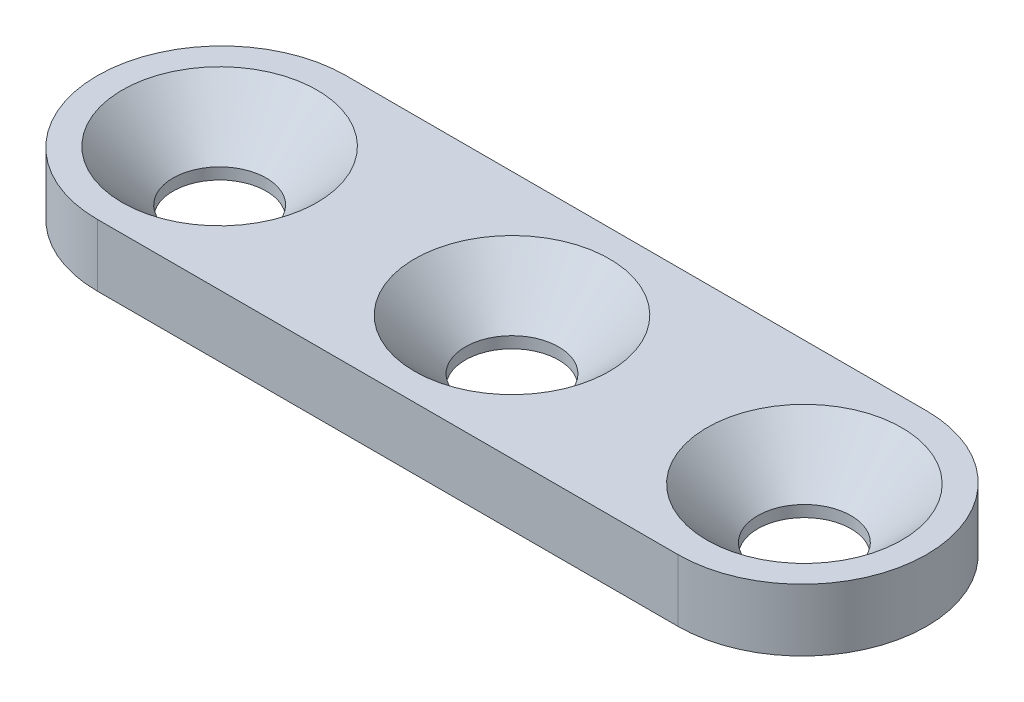
ISO-10303-21;
HEADER;
FILE_DESCRIPTION(('STEP AP214'),'2;1');
FILE_NAME('part.step','',(''),(''),'','','');
FILE_SCHEMA(('AUTOMOTIVE_DESIGN { 1 0 10303 214 1 1 1 1 }'));
ENDSEC;
DATA;
#1=APPLICATION_CONTEXT('core data for automotive mechanical design processes');
#2=APPLICATION_PROTOCOL_DEFINITION('international standard','automotive_design',2000,#1);
#3=PRODUCT_CONTEXT('',#1,'mechanical');
#4=PRODUCT('Part','Part','',(#3));
#5=PRODUCT_RELATED_PRODUCT_CATEGORY('part','',(#4));
#6=PRODUCT_DEFINITION_FORMATION('','',#4);
#7=PRODUCT_DEFINITION_CONTEXT('part definition',#1,'design');
#8=PRODUCT_DEFINITION('design','',#6,#7);
#9=PRODUCT_DEFINITION_SHAPE('','',#8);
#10=(LENGTH_UNIT() NAMED_UNIT(*) SI_UNIT(.MILLI.,.METRE.));
#11=(NAMED_UNIT(*) PLANE_ANGLE_UNIT() SI_UNIT($,.RADIAN.));
#12=(NAMED_UNIT(*) SI_UNIT($,.STERADIAN.) SOLID_ANGLE_UNIT());
#13=UNCERTAINTY_MEASURE_WITH_UNIT(LENGTH_MEASURE(1.E-05),#10,'distance_accuracy_value','');
#14=(GEOMETRIC_REPRESENTATION_CONTEXT(3) GLOBAL_UNCERTAINTY_ASSIGNED_CONTEXT((#13)) GLOBAL_UNIT_ASSIGNED_CONTEXT((#10,
#11,#12)) REPRESENTATION_CONTEXT('',''));
#15=CARTESIAN_POINT('',(0.,0.,0.));
#16=DIRECTION('',(0.,0.,1.));
#17=DIRECTION('',(1.,0.,0.));
#18=AXIS2_PLACEMENT_3D('',#15,#16,#17);
#19=CARTESIAN_POINT('',(14.,-3.,0.));
#20=DIRECTION('',(0.,1.,0.));
#21=DIRECTION('',(0.,0.,1.));
#22=AXIS2_PLACEMENT_3D('',#19,#20,#21);
#23=CYLINDRICAL_SURFACE('',#22,6.);
#24=CARTESIAN_POINT('',(14.,0.,0.));
#25=DIRECTION('',(0.,1.,0.));
#26=DIRECTION('',(0.,0.,1.));
#27=AXIS2_PLACEMENT_3D('',#24,#25,#26);
#28=CIRCLE('',#27,6.);
#29=CARTESIAN_POINT('',(14.,0.,6.));
#30=VERTEX_POINT('',#29);
#31=CARTESIAN_POINT('',(14.,0.,-6.));
#32=VERTEX_POINT('',#31);
#33=EDGE_CURVE('E108',#30,#32,#28,.T.);
#34=ORIENTED_EDGE('',*,*,#33,.F.);
#35=DIRECTION('',(0.,1.,0.));
#36=VECTOR('',#35,1.);
#37=CARTESIAN_POINT('',(14.,-3.,6.));
#38=LINE('',#37,#36);
#39=CARTESIAN_POINT('',(14.,-3.,6.));
#40=VERTEX_POINT('',#39);
#41=EDGE_CURVE('E11',#40,#30,#38,.T.);
#42=ORIENTED_EDGE('',*,*,#41,.F.);
#43=CARTESIAN_POINT('',(14.,-3.,0.));
#44=DIRECTION('',(0.,1.,0.));
#45=DIRECTION('',(0.,0.,1.));
#46=AXIS2_PLACEMENT_3D('',#43,#44,#45);
#47=CIRCLE('',#46,6.);
#48=CARTESIAN_POINT('',(14.,-3.,-6.));
#49=VERTEX_POINT('',#48);
#50=EDGE_CURVE('E101',#40,#49,#47,.T.);
#51=ORIENTED_EDGE('',*,*,#50,.T.);
#52=DIRECTION('',(0.,1.,0.));
#53=VECTOR('',#52,1.);
#54=CARTESIAN_POINT('',(14.,-3.,-6.));
#55=LINE('',#54,#53);
#56=EDGE_CURVE('E46',#49,#32,#55,.T.);
#57=ORIENTED_EDGE('',*,*,#56,.T.);
#58=EDGE_LOOP('',(#34,#42,#51,#57));
#59=FACE_BOUND('',#58,.T.);
#60=ADVANCED_FACE('F43',(#59),#23,.T.);
#61=CARTESIAN_POINT('',(14.,-3.,6.));
#62=DIRECTION('',(0.,0.,1.));
#63=DIRECTION('',(1.,0.,0.));
#64=AXIS2_PLACEMENT_3D('',#61,#62,#63);
#65=PLANE('',#64);
#66=DIRECTION('',(1.,0.,0.));
#67=VECTOR('',#66,1.);
#68=CARTESIAN_POINT('',(14.,0.,6.));
#69=LINE('',#68,#67);
#70=CARTESIAN_POINT('',(-14.,0.,6.));
#71=VERTEX_POINT('',#70);
#72=EDGE_CURVE('E103',#71,#30,#69,.T.);
#73=ORIENTED_EDGE('',*,*,#72,.F.);
#74=DIRECTION('',(0.,1.,0.));
#75=VECTOR('',#74,1.);
#76=CARTESIAN_POINT('',(-14.,-3.,6.));
#77=LINE('',#76,#75);
#78=CARTESIAN_POINT('',(-14.,-3.,6.));
#79=VERTEX_POINT('',#78);
#80=EDGE_CURVE('E52',#79,#71,#77,.T.);
#81=ORIENTED_EDGE('',*,*,#80,.F.);
#82=DIRECTION('',(1.,0.,0.));
#83=VECTOR('',#82,1.);
#84=CARTESIAN_POINT('',(14.,-3.,6.));
#85=LINE('',#84,#83);
#86=EDGE_CURVE('E98',#79,#40,#85,.T.);
#87=ORIENTED_EDGE('',*,*,#86,.T.);
#88=ORIENTED_EDGE('',*,*,#41,.T.);
#89=EDGE_LOOP('',(#73,#81,#87,#88));
#90=FACE_BOUND('',#89,.T.);
#91=ADVANCED_FACE('F119',(#90),#65,.T.);
#92=CARTESIAN_POINT('',(-14.,-3.,0.));
#93=DIRECTION('',(0.,1.,0.));
#94=DIRECTION('',(0.,0.,1.));
#95=AXIS2_PLACEMENT_3D('',#92,#93,#94);
#96=CYLINDRICAL_SURFACE('',#95,6.);
#97=CARTESIAN_POINT('',(-14.,0.,0.));
#98=DIRECTION('',(0.,1.,0.));
#99=DIRECTION('',(0.,0.,1.));
#100=AXIS2_PLACEMENT_3D('',#97,#98,#99);
#101=CIRCLE('',#100,6.);
#102=CARTESIAN_POINT('',(-14.,0.,-6.));
#103=VERTEX_POINT('',#102);
#104=EDGE_CURVE('E93',#103,#71,#101,.T.);
#105=ORIENTED_EDGE('',*,*,#104,.F.);
#106=DIRECTION('',(0.,1.,0.));
#107=VECTOR('',#106,1.);
#108=CARTESIAN_POINT('',(-14.,-3.,-6.));
#109=LINE('',#108,#107);
#110=CARTESIAN_POINT('',(-14.,-3.,-6.));
#111=VERTEX_POINT('',#110);
#112=EDGE_CURVE('E88',#111,#103,#109,.T.);
#113=ORIENTED_EDGE('',*,*,#112,.F.);
#114=CARTESIAN_POINT('',(-14.,-3.,0.));
#115=DIRECTION('',(0.,1.,0.));
#116=DIRECTION('',(0.,0.,1.));
#117=AXIS2_PLACEMENT_3D('',#114,#115,#116);
#118=CIRCLE('',#117,6.);
#119=EDGE_CURVE('E91',#111,#79,#118,.T.);
#120=ORIENTED_EDGE('',*,*,#119,.T.);
#121=ORIENTED_EDGE('',*,*,#80,.T.);
#122=EDGE_LOOP('',(#105,#113,#120,#121));
#123=FACE_BOUND('',#122,.T.);
#124=ADVANCED_FACE('F90',(#123),#96,.T.);
#125=CARTESIAN_POINT('',(14.,-3.,-6.));
#126=DIRECTION('',(0.,0.,-1.));
#127=DIRECTION('',(-1.,0.,0.));
#128=AXIS2_PLACEMENT_3D('',#125,#126,#127);
#129=PLANE('',#128);
#130=DIRECTION('',(-1.,0.,0.));
#131=VECTOR('',#130,1.);
#132=CARTESIAN_POINT('',(14.,0.,-6.));
#133=LINE('',#132,#131);
#134=EDGE_CURVE('E111',#32,#103,#133,.T.);
#135=ORIENTED_EDGE('',*,*,#134,.F.);
#136=ORIENTED_EDGE('',*,*,#56,.F.);
#137=DIRECTION('',(-1.,0.,0.));
#138=VECTOR('',#137,1.);
#139=CARTESIAN_POINT('',(14.,-3.,-6.));
#140=LINE('',#139,#138);
#141=EDGE_CURVE('E97',#49,#111,#140,.T.);
#142=ORIENTED_EDGE('',*,*,#141,.T.);
#143=ORIENTED_EDGE('',*,*,#112,.T.);
#144=EDGE_LOOP('',(#135,#136,#142,#143));
#145=FACE_BOUND('',#144,.T.);
#146=ADVANCED_FACE('F100',(#145),#129,.T.);
#147=CARTESIAN_POINT('',(14.,-3.,0.));
#148=DIRECTION('',(0.,1.,0.));
#149=DIRECTION('',(0.,0.,1.));
#150=AXIS2_PLACEMENT_3D('',#147,#148,#149);
#151=PLANE('',#150);
#152=CARTESIAN_POINT('',(0.,-3.,0.));
#153=DIRECTION('',(0.,1.,0.));
#154=DIRECTION('',(0.,0.,1.));
#155=AXIS2_PLACEMENT_3D('',#152,#153,#154);
#156=CIRCLE('',#155,2.24999999999999);
#157=CARTESIAN_POINT('',(0.,-3.,2.24999999999999));
#158=VERTEX_POINT('',#157);
#159=EDGE_CURVE('E174',#158,#158,#156,.T.);
#160=ORIENTED_EDGE('',*,*,#159,.T.);
#161=EDGE_LOOP('',(#160));
#162=FACE_BOUND('',#161,.T.);
#163=CARTESIAN_POINT('',(-14.1,-3.,0.));
#164=DIRECTION('',(0.,1.,0.));
#165=DIRECTION('',(0.,0.,1.));
#166=AXIS2_PLACEMENT_3D('',#163,#164,#165);
#167=CIRCLE('',#166,2.24999999999999);
#168=CARTESIAN_POINT('',(-14.1,-3.,2.24999999999999));
#169=VERTEX_POINT('',#168);
#170=EDGE_CURVE('E184',#169,#169,#167,.T.);
#171=ORIENTED_EDGE('',*,*,#170,.T.);
#172=EDGE_LOOP('',(#171));
#173=FACE_BOUND('',#172,.T.);
#174=CARTESIAN_POINT('',(14.1,-3.,0.));
#175=DIRECTION('',(0.,1.,0.));
#176=DIRECTION('',(0.,0.,1.));
#177=AXIS2_PLACEMENT_3D('',#174,#175,#176);
#178=CIRCLE('',#177,2.24999999999999);
#179=CARTESIAN_POINT('',(14.1,-3.,2.24999999999999));
#180=VERTEX_POINT('',#179);
#181=EDGE_CURVE('E112',#180,#180,#178,.T.);
#182=ORIENTED_EDGE('',*,*,#181,.T.);
#183=EDGE_LOOP('',(#182));
#184=FACE_BOUND('',#183,.T.);
#185=ORIENTED_EDGE('',*,*,#50,.F.);
#186=ORIENTED_EDGE('',*,*,#86,.F.);
#187=ORIENTED_EDGE('',*,*,#119,.F.);
#188=ORIENTED_EDGE('',*,*,#141,.F.);
#189=EDGE_LOOP('',(#185,#186,#187,#188));
#190=FACE_BOUND('',#189,.T.);
#191=ADVANCED_FACE('F96',(#162,#173,#184,#190),#151,.F.);
#192=CARTESIAN_POINT('',(14.,0.,0.));
#193=DIRECTION('',(0.,1.,0.));
#194=DIRECTION('',(0.,0.,1.));
#195=AXIS2_PLACEMENT_3D('',#192,#193,#194);
#196=PLANE('',#195);
#197=CARTESIAN_POINT('',(0.,0.,0.));
#198=DIRECTION('',(0.,1.,0.));
#199=DIRECTION('',(0.,0.,1.));
#200=AXIS2_PLACEMENT_3D('',#197,#198,#199);
#201=CIRCLE('',#200,4.7);
#202=CARTESIAN_POINT('',(0.,0.,4.7));
#203=VERTEX_POINT('',#202);
#204=EDGE_CURVE('E172',#203,#203,#201,.T.);
#205=ORIENTED_EDGE('',*,*,#204,.F.);
#206=EDGE_LOOP('',(#205));
#207=FACE_BOUND('',#206,.T.);
#208=CARTESIAN_POINT('',(-14.1,0.,0.));
#209=DIRECTION('',(0.,1.,0.));
#210=DIRECTION('',(0.,0.,1.));
#211=AXIS2_PLACEMENT_3D('',#208,#209,#210);
#212=CIRCLE('',#211,4.7);
#213=CARTESIAN_POINT('',(-14.1,0.,4.7));
#214=VERTEX_POINT('',#213);
#215=EDGE_CURVE('E178',#214,#214,#212,.T.);
#216=ORIENTED_EDGE('',*,*,#215,.F.);
#217=EDGE_LOOP('',(#216));
#218=FACE_BOUND('',#217,.T.);
#219=CARTESIAN_POINT('',(14.1,0.,0.));
#220=DIRECTION('',(0.,1.,0.));
#221=DIRECTION('',(0.,0.,1.));
#222=AXIS2_PLACEMENT_3D('',#219,#220,#221);
#223=CIRCLE('',#222,4.7);
#224=CARTESIAN_POINT('',(14.1,0.,4.7));
#225=VERTEX_POINT('',#224);
#226=EDGE_CURVE('E187',#225,#225,#223,.T.);
#227=ORIENTED_EDGE('',*,*,#226,.F.);
#228=EDGE_LOOP('',(#227));
#229=FACE_BOUND('',#228,.T.);
#230=ORIENTED_EDGE('',*,*,#33,.T.);
#231=ORIENTED_EDGE('',*,*,#134,.T.);
#232=ORIENTED_EDGE('',*,*,#104,.T.);
#233=ORIENTED_EDGE('',*,*,#72,.T.);
#234=EDGE_LOOP('',(#230,#231,#232,#233));
#235=FACE_BOUND('',#234,.T.);
#236=ADVANCED_FACE('F118',(#207,#218,#229,#235),#196,.T.);
#237=CARTESIAN_POINT('',(14.1,0.,0.));
#238=DIRECTION('',(0.,1.,0.));
#239=DIRECTION('',(0.,0.,1.));
#240=AXIS2_PLACEMENT_3D('',#237,#238,#239);
#241=CYLINDRICAL_SURFACE('',#240,2.24999999999999);
#242=ORIENTED_EDGE('',*,*,#181,.F.);
#243=EDGE_LOOP('',(#242));
#244=FACE_BOUND('',#243,.T.);
#245=CARTESIAN_POINT('',(14.1,-2.45000000000001,0.));
#246=DIRECTION('',(0.,1.,0.));
#247=DIRECTION('',(0.,0.,1.));
#248=AXIS2_PLACEMENT_3D('',#245,#246,#247);
#249=CIRCLE('',#248,2.24999999999999);
#250=CARTESIAN_POINT('',(14.1,-2.45000000000001,2.24999999999999));
#251=VERTEX_POINT('',#250);
#252=EDGE_CURVE('E190',#251,#251,#249,.T.);
#253=ORIENTED_EDGE('',*,*,#252,.T.);
#254=EDGE_LOOP('',(#253));
#255=FACE_BOUND('',#254,.T.);
#256=ADVANCED_FACE('F137',(#244,#255),#241,.F.);
#257=CARTESIAN_POINT('',(14.1,0.,0.));
#258=DIRECTION('',(0.,1.,0.));
#259=DIRECTION('',(0.,0.,1.));
#260=AXIS2_PLACEMENT_3D('',#257,#258,#259);
#261=CONICAL_SURFACE('',#260,4.7,0.785398163397448);
#262=ORIENTED_EDGE('',*,*,#252,.F.);
#263=EDGE_LOOP('',(#262));
#264=FACE_BOUND('',#263,.T.);
#265=ORIENTED_EDGE('',*,*,#226,.T.);
#266=EDGE_LOOP('',(#265));
#267=FACE_BOUND('',#266,.T.);
#268=ADVANCED_FACE('F144',(#264,#267),#261,.F.);
#269=CARTESIAN_POINT('',(-14.1,0.,0.));
#270=DIRECTION('',(0.,1.,0.));
#271=DIRECTION('',(0.,0.,1.));
#272=AXIS2_PLACEMENT_3D('',#269,#270,#271);
#273=CYLINDRICAL_SURFACE('',#272,2.24999999999999);
#274=ORIENTED_EDGE('',*,*,#170,.F.);
#275=EDGE_LOOP('',(#274));
#276=FACE_BOUND('',#275,.T.);
#277=CARTESIAN_POINT('',(-14.1,-2.45000000000001,0.));
#278=DIRECTION('',(0.,1.,0.));
#279=DIRECTION('',(0.,0.,1.));
#280=AXIS2_PLACEMENT_3D('',#277,#278,#279);
#281=CIRCLE('',#280,2.24999999999999);
#282=CARTESIAN_POINT('',(-14.1,-2.45000000000001,2.24999999999999));
#283=VERTEX_POINT('',#282);
#284=EDGE_CURVE('E181',#283,#283,#281,.T.);
#285=ORIENTED_EDGE('',*,*,#284,.T.);
#286=EDGE_LOOP('',(#285));
#287=FACE_BOUND('',#286,.T.);
#288=ADVANCED_FACE('F148',(#276,#287),#273,.F.);
#289=CARTESIAN_POINT('',(-14.1,0.,0.));
#290=DIRECTION('',(0.,1.,0.));
#291=DIRECTION('',(0.,0.,1.));
#292=AXIS2_PLACEMENT_3D('',#289,#290,#291);
#293=CONICAL_SURFACE('',#292,4.7,0.785398163397449);
#294=ORIENTED_EDGE('',*,*,#284,.F.);
#295=EDGE_LOOP('',(#294));
#296=FACE_BOUND('',#295,.T.);
#297=ORIENTED_EDGE('',*,*,#215,.T.);
#298=EDGE_LOOP('',(#297));
#299=FACE_BOUND('',#298,.T.);
#300=ADVANCED_FACE('F152',(#296,#299),#293,.F.);
#301=CARTESIAN_POINT('',(0.,0.,0.));
#302=DIRECTION('',(0.,1.,0.));
#303=DIRECTION('',(0.,0.,1.));
#304=AXIS2_PLACEMENT_3D('',#301,#302,#303);
#305=CYLINDRICAL_SURFACE('',#304,2.24999999999999);
#306=ORIENTED_EDGE('',*,*,#159,.F.);
#307=EDGE_LOOP('',(#306));
#308=FACE_BOUND('',#307,.T.);
#309=CARTESIAN_POINT('',(0.,-2.45000000000001,0.));
#310=DIRECTION('',(0.,1.,0.));
#311=DIRECTION('',(0.,0.,1.));
#312=AXIS2_PLACEMENT_3D('',#309,#310,#311);
#313=CIRCLE('',#312,2.24999999999999);
#314=CARTESIAN_POINT('',(0.,-2.45000000000001,2.24999999999999));
#315=VERTEX_POINT('',#314);
#316=EDGE_CURVE('E169',#315,#315,#313,.T.);
#317=ORIENTED_EDGE('',*,*,#316,.T.);
#318=EDGE_LOOP('',(#317));
#319=FACE_BOUND('',#318,.T.);
#320=ADVANCED_FACE('F156',(#308,#319),#305,.F.);
#321=CARTESIAN_POINT('',(0.,0.,0.));
#322=DIRECTION('',(0.,1.,0.));
#323=DIRECTION('',(0.,0.,1.));
#324=AXIS2_PLACEMENT_3D('',#321,#322,#323);
#325=CONICAL_SURFACE('',#324,4.7,0.785398163397449);
#326=ORIENTED_EDGE('',*,*,#316,.F.);
#327=EDGE_LOOP('',(#326));
#328=FACE_BOUND('',#327,.T.);
#329=ORIENTED_EDGE('',*,*,#204,.T.);
#330=EDGE_LOOP('',(#329));
#331=FACE_BOUND('',#330,.T.);
#332=ADVANCED_FACE('F160',(#328,#331),#325,.F.);
#333=CLOSED_SHELL('',(#60,#91,#124,#146,#191,#236,#256,#268,#288,#300,#320,#332));
#334=MANIFOLD_SOLID_BREP('B2',#333);
#335=ADVANCED_BREP_SHAPE_REPRESENTATION('',(#18,#334),#14);
#336=SHAPE_DEFINITION_REPRESENTATION(#9,#335);
ENDSEC;
END-ISO-10303-21;
